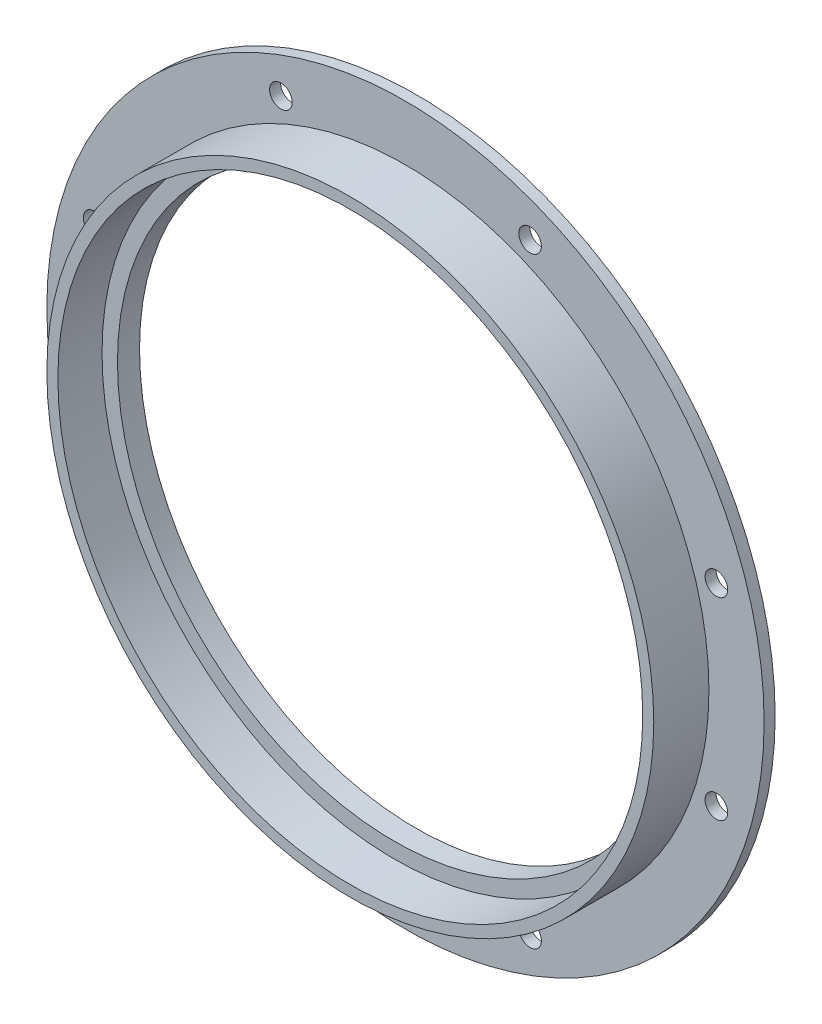
ISO-10303-21;
HEADER;
FILE_DESCRIPTION(('STEP AP214'),'2;1');
FILE_NAME('part.step','',(''),(''),'','','');
FILE_SCHEMA(('AUTOMOTIVE_DESIGN { 1 0 10303 214 1 1 1 1 }'));
ENDSEC;
DATA;
#1=APPLICATION_CONTEXT('core data for automotive mechanical design processes');
#2=APPLICATION_PROTOCOL_DEFINITION('international standard','automotive_design',2000,#1);
#3=PRODUCT_CONTEXT('',#1,'mechanical');
#4=PRODUCT('Part','Part','',(#3));
#5=PRODUCT_RELATED_PRODUCT_CATEGORY('part','',(#4));
#6=PRODUCT_DEFINITION_FORMATION('','',#4);
#7=PRODUCT_DEFINITION_CONTEXT('part definition',#1,'design');
#8=PRODUCT_DEFINITION('design','',#6,#7);
#9=PRODUCT_DEFINITION_SHAPE('','',#8);
#10=(LENGTH_UNIT() NAMED_UNIT(*) SI_UNIT(.MILLI.,.METRE.));
#11=(NAMED_UNIT(*) PLANE_ANGLE_UNIT() SI_UNIT($,.RADIAN.));
#12=(NAMED_UNIT(*) SI_UNIT($,.STERADIAN.) SOLID_ANGLE_UNIT());
#13=UNCERTAINTY_MEASURE_WITH_UNIT(LENGTH_MEASURE(1.E-05),#10,'distance_accuracy_value','');
#14=(GEOMETRIC_REPRESENTATION_CONTEXT(3) GLOBAL_UNCERTAINTY_ASSIGNED_CONTEXT((#13)) GLOBAL_UNIT_ASSIGNED_CONTEXT((#10,
#11,#12)) REPRESENTATION_CONTEXT('',''));
#15=CARTESIAN_POINT('',(0.,0.,0.));
#16=DIRECTION('',(0.,0.,1.));
#17=DIRECTION('',(1.,0.,0.));
#18=AXIS2_PLACEMENT_3D('',#15,#16,#17);
#19=CARTESIAN_POINT('',(0.,0.,2.));
#20=DIRECTION('',(0.,0.,1.));
#21=DIRECTION('',(1.,0.,0.));
#22=AXIS2_PLACEMENT_3D('',#19,#20,#21);
#23=CYLINDRICAL_SURFACE('',#22,55.);
#24=CARTESIAN_POINT('',(0.,0.,10.));
#25=DIRECTION('',(0.,0.,1.));
#26=DIRECTION('',(1.,0.,0.));
#27=AXIS2_PLACEMENT_3D('',#24,#25,#26);
#28=CIRCLE('',#27,55.);
#29=CARTESIAN_POINT('',(55.,0.,10.));
#30=VERTEX_POINT('',#29);
#31=EDGE_CURVE('E41',#30,#30,#28,.T.);
#32=ORIENTED_EDGE('',*,*,#31,.F.);
#33=EDGE_LOOP('',(#32));
#34=FACE_BOUND('',#33,.T.);
#35=CARTESIAN_POINT('',(0.,0.,0.));
#36=DIRECTION('',(0.,0.,-1.));
#37=DIRECTION('',(-1.,0.,0.));
#38=AXIS2_PLACEMENT_3D('',#35,#36,#37);
#39=CIRCLE('',#38,55.);
#40=CARTESIAN_POINT('',(-55.,0.,0.));
#41=VERTEX_POINT('',#40);
#42=EDGE_CURVE('E61',#41,#41,#39,.F.);
#43=ORIENTED_EDGE('',*,*,#42,.T.);
#44=EDGE_LOOP('',(#43));
#45=FACE_BOUND('',#44,.T.);
#46=ADVANCED_FACE('F37',(#34,#45),#23,.T.);
#47=CARTESIAN_POINT('',(0.,0.,159.906637611548));
#48=DIRECTION('',(0.,0.,-1.));
#49=DIRECTION('',(-1.,0.,0.));
#50=AXIS2_PLACEMENT_3D('',#47,#48,#49);
#51=CYLINDRICAL_SURFACE('',#50,53.);
#52=CARTESIAN_POINT('',(0.,0.,10.));
#53=DIRECTION('',(0.,0.,1.));
#54=DIRECTION('',(1.,0.,0.));
#55=AXIS2_PLACEMENT_3D('',#52,#53,#54);
#56=CIRCLE('',#55,53.);
#57=CARTESIAN_POINT('',(53.,0.,10.));
#58=VERTEX_POINT('',#57);
#59=EDGE_CURVE('E49',#58,#58,#56,.T.);
#60=ORIENTED_EDGE('',*,*,#59,.T.);
#61=EDGE_LOOP('',(#60));
#62=FACE_BOUND('',#61,.T.);
#63=CARTESIAN_POINT('',(0.,0.,2.));
#64=DIRECTION('',(0.,0.,-1.));
#65=DIRECTION('',(-1.,0.,0.));
#66=AXIS2_PLACEMENT_3D('',#63,#64,#65);
#67=CIRCLE('',#66,53.);
#68=CARTESIAN_POINT('',(-53.,0.,2.));
#69=VERTEX_POINT('',#68);
#70=EDGE_CURVE('E11',#69,#69,#67,.F.);
#71=ORIENTED_EDGE('',*,*,#70,.F.);
#72=EDGE_LOOP('',(#71));
#73=FACE_BOUND('',#72,.T.);
#74=ADVANCED_FACE('F166',(#62,#73),#51,.F.);
#75=CARTESIAN_POINT('',(0.,0.,10.));
#76=DIRECTION('',(0.,0.,1.));
#77=DIRECTION('',(1.,0.,0.));
#78=AXIS2_PLACEMENT_3D('',#75,#76,#77);
#79=PLANE('',#78);
#80=ORIENTED_EDGE('',*,*,#59,.F.);
#81=EDGE_LOOP('',(#80));
#82=FACE_BOUND('',#81,.T.);
#83=ORIENTED_EDGE('',*,*,#31,.T.);
#84=EDGE_LOOP('',(#83));
#85=FACE_BOUND('',#84,.T.);
#86=ADVANCED_FACE('F39',(#82,#85),#79,.T.);
#87=CARTESIAN_POINT('',(0.,0.,2.));
#88=DIRECTION('',(0.,0.,-1.));
#89=DIRECTION('',(-1.,0.,0.));
#90=AXIS2_PLACEMENT_3D('',#87,#88,#89);
#91=PLANE('',#90);
#92=CARTESIAN_POINT('',(0.,0.,2.));
#93=DIRECTION('',(0.,0.,-1.));
#94=DIRECTION('',(-1.,0.,0.));
#95=AXIS2_PLACEMENT_3D('',#92,#93,#94);
#96=CIRCLE('',#95,50.2);
#97=CARTESIAN_POINT('',(-50.2,0.,2.));
#98=VERTEX_POINT('',#97);
#99=EDGE_CURVE('E51',#98,#98,#96,.T.);
#100=ORIENTED_EDGE('',*,*,#99,.T.);
#101=EDGE_LOOP('',(#100));
#102=FACE_BOUND('',#101,.T.);
#103=ORIENTED_EDGE('',*,*,#70,.T.);
#104=EDGE_LOOP('',(#103));
#105=FACE_BOUND('',#104,.T.);
#106=ADVANCED_FACE('F134',(#102,#105),#91,.F.);
#107=CARTESIAN_POINT('',(0.,0.,-2.));
#108=DIRECTION('',(0.,0.,-1.));
#109=DIRECTION('',(-1.,0.,0.));
#110=AXIS2_PLACEMENT_3D('',#107,#108,#109);
#111=PLANE('',#110);
#112=CARTESIAN_POINT('',(0.,0.,-2.));
#113=DIRECTION('',(0.,0.,-1.));
#114=DIRECTION('',(-1.,0.,0.));
#115=AXIS2_PLACEMENT_3D('',#112,#113,#114);
#116=CIRCLE('',#115,50.2);
#117=CARTESIAN_POINT('',(-50.2,0.,-2.));
#118=VERTEX_POINT('',#117);
#119=EDGE_CURVE('E54',#118,#118,#116,.T.);
#120=ORIENTED_EDGE('',*,*,#119,.F.);
#121=EDGE_LOOP('',(#120));
#122=FACE_BOUND('',#121,.T.);
#123=CARTESIAN_POINT('',(22.5783225095407,54.5088924181658,-2.));
#124=DIRECTION('',(0.,0.,-1.));
#125=DIRECTION('',(-1.,0.,0.));
#126=AXIS2_PLACEMENT_3D('',#123,#124,#125);
#127=CIRCLE('',#126,2.05);
#128=CARTESIAN_POINT('',(20.5283225095407,54.5088924181658,-2.));
#129=VERTEX_POINT('',#128);
#130=EDGE_CURVE('E114',#129,#129,#127,.T.);
#131=ORIENTED_EDGE('',*,*,#130,.F.);
#132=EDGE_LOOP('',(#131));
#133=FACE_BOUND('',#132,.T.);
#134=CARTESIAN_POINT('',(-56.3449199129788,-17.5,-2.));
#135=DIRECTION('',(0.,0.,-1.));
#136=DIRECTION('',(-1.,0.,0.));
#137=AXIS2_PLACEMENT_3D('',#134,#135,#136);
#138=CIRCLE('',#137,2.04999999999999);
#139=CARTESIAN_POINT('',(-58.3949199129788,-17.5,-2.));
#140=VERTEX_POINT('',#139);
#141=EDGE_CURVE('E108',#140,#140,#138,.T.);
#142=ORIENTED_EDGE('',*,*,#141,.F.);
#143=EDGE_LOOP('',(#142));
#144=FACE_BOUND('',#143,.T.);
#145=CARTESIAN_POINT('',(-56.3449199129788,17.5,-2.));
#146=DIRECTION('',(0.,0.,-1.));
#147=DIRECTION('',(-1.,0.,0.));
#148=AXIS2_PLACEMENT_3D('',#145,#146,#147);
#149=CIRCLE('',#148,2.04999999999999);
#150=CARTESIAN_POINT('',(-58.3949199129788,17.5,-2.));
#151=VERTEX_POINT('',#150);
#152=EDGE_CURVE('E102',#151,#151,#149,.T.);
#153=ORIENTED_EDGE('',*,*,#152,.F.);
#154=EDGE_LOOP('',(#153));
#155=FACE_BOUND('',#154,.T.);
#156=CARTESIAN_POINT('',(22.5783225095399,-54.5088924181661,-2.));
#157=DIRECTION('',(0.,0.,-1.));
#158=DIRECTION('',(-1.,0.,0.));
#159=AXIS2_PLACEMENT_3D('',#156,#157,#158);
#160=CIRCLE('',#159,2.05);
#161=CARTESIAN_POINT('',(20.5283225095399,-54.5088924181661,-2.));
#162=VERTEX_POINT('',#161);
#163=EDGE_CURVE('E96',#162,#162,#160,.T.);
#164=ORIENTED_EDGE('',*,*,#163,.F.);
#165=EDGE_LOOP('',(#164));
#166=FACE_BOUND('',#165,.T.);
#167=CARTESIAN_POINT('',(-22.5783225095407,-54.5088924181658,-2.));
#168=DIRECTION('',(0.,0.,-1.));
#169=DIRECTION('',(-1.,0.,0.));
#170=AXIS2_PLACEMENT_3D('',#167,#168,#169);
#171=CIRCLE('',#170,2.05);
#172=CARTESIAN_POINT('',(-24.6283225095406,-54.5088924181658,-2.));
#173=VERTEX_POINT('',#172);
#174=EDGE_CURVE('E90',#173,#173,#171,.T.);
#175=ORIENTED_EDGE('',*,*,#174,.F.);
#176=EDGE_LOOP('',(#175));
#177=FACE_BOUND('',#176,.T.);
#178=CARTESIAN_POINT('',(56.3449199129789,-17.5,-2.));
#179=DIRECTION('',(0.,0.,-1.));
#180=DIRECTION('',(-1.,0.,0.));
#181=AXIS2_PLACEMENT_3D('',#178,#179,#180);
#182=CIRCLE('',#181,2.04999999999999);
#183=CARTESIAN_POINT('',(54.2949199129789,-17.5,-2.));
#184=VERTEX_POINT('',#183);
#185=EDGE_CURVE('E84',#184,#184,#182,.T.);
#186=ORIENTED_EDGE('',*,*,#185,.F.);
#187=EDGE_LOOP('',(#186));
#188=FACE_BOUND('',#187,.T.);
#189=CARTESIAN_POINT('',(56.3449199129789,17.5,-2.));
#190=DIRECTION('',(0.,0.,-1.));
#191=DIRECTION('',(-1.,0.,0.));
#192=AXIS2_PLACEMENT_3D('',#189,#190,#191);
#193=CIRCLE('',#192,2.04999999999999);
#194=CARTESIAN_POINT('',(54.2949199129789,17.5,-2.));
#195=VERTEX_POINT('',#194);
#196=EDGE_CURVE('E78',#195,#195,#193,.T.);
#197=ORIENTED_EDGE('',*,*,#196,.F.);
#198=EDGE_LOOP('',(#197));
#199=FACE_BOUND('',#198,.T.);
#200=CARTESIAN_POINT('',(-22.57832250954,54.5088924181661,-2.));
#201=DIRECTION('',(0.,0.,-1.));
#202=DIRECTION('',(-1.,0.,0.));
#203=AXIS2_PLACEMENT_3D('',#200,#201,#202);
#204=CIRCLE('',#203,2.05);
#205=CARTESIAN_POINT('',(-24.6283225095399,54.5088924181661,-2.));
#206=VERTEX_POINT('',#205);
#207=EDGE_CURVE('E72',#206,#206,#204,.T.);
#208=ORIENTED_EDGE('',*,*,#207,.F.);
#209=EDGE_LOOP('',(#208));
#210=FACE_BOUND('',#209,.T.);
#211=CARTESIAN_POINT('',(0.,0.,-2.));
#212=DIRECTION('',(0.,0.,-1.));
#213=DIRECTION('',(-1.,0.,0.));
#214=AXIS2_PLACEMENT_3D('',#211,#212,#213);
#215=CIRCLE('',#214,65.);
#216=CARTESIAN_POINT('',(-65.,0.,-2.));
#217=VERTEX_POINT('',#216);
#218=EDGE_CURVE('E66',#217,#217,#215,.T.);
#219=ORIENTED_EDGE('',*,*,#218,.T.);
#220=EDGE_LOOP('',(#219));
#221=FACE_BOUND('',#220,.T.);
#222=ADVANCED_FACE('F130',(#122,#133,#144,#155,#166,#177,#188,#199,#210,#221),#111,.T.);
#223=CARTESIAN_POINT('',(0.,0.,-2.));
#224=DIRECTION('',(0.,0.,1.));
#225=DIRECTION('',(1.,0.,0.));
#226=AXIS2_PLACEMENT_3D('',#223,#224,#225);
#227=CYLINDRICAL_SURFACE('',#226,50.2);
#228=ORIENTED_EDGE('',*,*,#119,.T.);
#229=EDGE_LOOP('',(#228));
#230=FACE_BOUND('',#229,.T.);
#231=ORIENTED_EDGE('',*,*,#99,.F.);
#232=EDGE_LOOP('',(#231));
#233=FACE_BOUND('',#232,.T.);
#234=ADVANCED_FACE('F133',(#230,#233),#227,.F.);
#235=CARTESIAN_POINT('',(0.,0.,0.));
#236=DIRECTION('',(0.,0.,-1.));
#237=DIRECTION('',(-1.,0.,0.));
#238=AXIS2_PLACEMENT_3D('',#235,#236,#237);
#239=CYLINDRICAL_SURFACE('',#238,65.);
#240=CARTESIAN_POINT('',(0.,0.,0.));
#241=DIRECTION('',(0.,0.,-1.));
#242=DIRECTION('',(-1.,0.,0.));
#243=AXIS2_PLACEMENT_3D('',#240,#241,#242);
#244=CIRCLE('',#243,65.);
#245=CARTESIAN_POINT('',(-65.,0.,0.));
#246=VERTEX_POINT('',#245);
#247=EDGE_CURVE('E65',#246,#246,#244,.T.);
#248=ORIENTED_EDGE('',*,*,#247,.T.);
#249=EDGE_LOOP('',(#248));
#250=FACE_BOUND('',#249,.T.);
#251=ORIENTED_EDGE('',*,*,#218,.F.);
#252=EDGE_LOOP('',(#251));
#253=FACE_BOUND('',#252,.T.);
#254=ADVANCED_FACE('F153',(#250,#253),#239,.T.);
#255=CARTESIAN_POINT('',(0.,0.,0.));
#256=DIRECTION('',(0.,0.,-1.));
#257=DIRECTION('',(-1.,0.,0.));
#258=AXIS2_PLACEMENT_3D('',#255,#256,#257);
#259=PLANE('',#258);
#260=ORIENTED_EDGE('',*,*,#42,.F.);
#261=EDGE_LOOP('',(#260));
#262=FACE_BOUND('',#261,.T.);
#263=CARTESIAN_POINT('',(22.5783225095407,54.5088924181658,0.));
#264=DIRECTION('',(0.,0.,-1.));
#265=DIRECTION('',(-1.,0.,0.));
#266=AXIS2_PLACEMENT_3D('',#263,#264,#265);
#267=CIRCLE('',#266,2.05);
#268=CARTESIAN_POINT('',(20.5283225095407,54.5088924181658,0.));
#269=VERTEX_POINT('',#268);
#270=EDGE_CURVE('E111',#269,#269,#267,.T.);
#271=ORIENTED_EDGE('',*,*,#270,.T.);
#272=EDGE_LOOP('',(#271));
#273=FACE_BOUND('',#272,.T.);
#274=CARTESIAN_POINT('',(-56.3449199129788,-17.5,0.));
#275=DIRECTION('',(0.,0.,-1.));
#276=DIRECTION('',(-1.,0.,0.));
#277=AXIS2_PLACEMENT_3D('',#274,#275,#276);
#278=CIRCLE('',#277,2.04999999999999);
#279=CARTESIAN_POINT('',(-58.3949199129788,-17.5,0.));
#280=VERTEX_POINT('',#279);
#281=EDGE_CURVE('E105',#280,#280,#278,.T.);
#282=ORIENTED_EDGE('',*,*,#281,.T.);
#283=EDGE_LOOP('',(#282));
#284=FACE_BOUND('',#283,.T.);
#285=CARTESIAN_POINT('',(-56.3449199129788,17.5,0.));
#286=DIRECTION('',(0.,0.,-1.));
#287=DIRECTION('',(-1.,0.,0.));
#288=AXIS2_PLACEMENT_3D('',#285,#286,#287);
#289=CIRCLE('',#288,2.04999999999999);
#290=CARTESIAN_POINT('',(-58.3949199129788,17.5,0.));
#291=VERTEX_POINT('',#290);
#292=EDGE_CURVE('E99',#291,#291,#289,.T.);
#293=ORIENTED_EDGE('',*,*,#292,.T.);
#294=EDGE_LOOP('',(#293));
#295=FACE_BOUND('',#294,.T.);
#296=CARTESIAN_POINT('',(22.5783225095399,-54.5088924181661,0.));
#297=DIRECTION('',(0.,0.,-1.));
#298=DIRECTION('',(-1.,0.,0.));
#299=AXIS2_PLACEMENT_3D('',#296,#297,#298);
#300=CIRCLE('',#299,2.05);
#301=CARTESIAN_POINT('',(20.5283225095399,-54.5088924181661,0.));
#302=VERTEX_POINT('',#301);
#303=EDGE_CURVE('E93',#302,#302,#300,.T.);
#304=ORIENTED_EDGE('',*,*,#303,.T.);
#305=EDGE_LOOP('',(#304));
#306=FACE_BOUND('',#305,.T.);
#307=CARTESIAN_POINT('',(-22.5783225095407,-54.5088924181658,0.));
#308=DIRECTION('',(0.,0.,-1.));
#309=DIRECTION('',(-1.,0.,0.));
#310=AXIS2_PLACEMENT_3D('',#307,#308,#309);
#311=CIRCLE('',#310,2.05);
#312=CARTESIAN_POINT('',(-24.6283225095406,-54.5088924181658,0.));
#313=VERTEX_POINT('',#312);
#314=EDGE_CURVE('E87',#313,#313,#311,.T.);
#315=ORIENTED_EDGE('',*,*,#314,.T.);
#316=EDGE_LOOP('',(#315));
#317=FACE_BOUND('',#316,.T.);
#318=CARTESIAN_POINT('',(56.3449199129789,-17.5,0.));
#319=DIRECTION('',(0.,0.,-1.));
#320=DIRECTION('',(-1.,0.,0.));
#321=AXIS2_PLACEMENT_3D('',#318,#319,#320);
#322=CIRCLE('',#321,2.04999999999999);
#323=CARTESIAN_POINT('',(54.2949199129789,-17.5,0.));
#324=VERTEX_POINT('',#323);
#325=EDGE_CURVE('E81',#324,#324,#322,.T.);
#326=ORIENTED_EDGE('',*,*,#325,.T.);
#327=EDGE_LOOP('',(#326));
#328=FACE_BOUND('',#327,.T.);
#329=CARTESIAN_POINT('',(56.3449199129789,17.5,0.));
#330=DIRECTION('',(0.,0.,-1.));
#331=DIRECTION('',(-1.,0.,0.));
#332=AXIS2_PLACEMENT_3D('',#329,#330,#331);
#333=CIRCLE('',#332,2.04999999999999);
#334=CARTESIAN_POINT('',(54.2949199129789,17.5,0.));
#335=VERTEX_POINT('',#334);
#336=EDGE_CURVE('E75',#335,#335,#333,.T.);
#337=ORIENTED_EDGE('',*,*,#336,.T.);
#338=EDGE_LOOP('',(#337));
#339=FACE_BOUND('',#338,.T.);
#340=CARTESIAN_POINT('',(-22.57832250954,54.5088924181661,0.));
#341=DIRECTION('',(0.,0.,-1.));
#342=DIRECTION('',(-1.,0.,0.));
#343=AXIS2_PLACEMENT_3D('',#340,#341,#342);
#344=CIRCLE('',#343,2.05);
#345=CARTESIAN_POINT('',(-24.6283225095399,54.5088924181661,0.));
#346=VERTEX_POINT('',#345);
#347=EDGE_CURVE('E69',#346,#346,#344,.T.);
#348=ORIENTED_EDGE('',*,*,#347,.T.);
#349=EDGE_LOOP('',(#348));
#350=FACE_BOUND('',#349,.T.);
#351=ORIENTED_EDGE('',*,*,#247,.F.);
#352=EDGE_LOOP('',(#351));
#353=FACE_BOUND('',#352,.T.);
#354=ADVANCED_FACE('F120',(#262,#273,#284,#295,#306,#317,#328,#339,#350,#353),#259,.F.);
#355=CARTESIAN_POINT('',(-22.57832250954,54.5088924181661,0.));
#356=DIRECTION('',(0.,0.,-1.));
#357=DIRECTION('',(-1.,0.,0.));
#358=AXIS2_PLACEMENT_3D('',#355,#356,#357);
#359=CYLINDRICAL_SURFACE('',#358,2.05);
#360=ORIENTED_EDGE('',*,*,#347,.F.);
#361=EDGE_LOOP('',(#360));
#362=FACE_BOUND('',#361,.T.);
#363=ORIENTED_EDGE('',*,*,#207,.T.);
#364=EDGE_LOOP('',(#363));
#365=FACE_BOUND('',#364,.T.);
#366=ADVANCED_FACE('F161',(#362,#365),#359,.F.);
#367=CARTESIAN_POINT('',(56.3449199129789,17.5,0.));
#368=DIRECTION('',(0.,0.,-1.));
#369=DIRECTION('',(-1.,0.,0.));
#370=AXIS2_PLACEMENT_3D('',#367,#368,#369);
#371=CYLINDRICAL_SURFACE('',#370,2.04999999999999);
#372=ORIENTED_EDGE('',*,*,#336,.F.);
#373=EDGE_LOOP('',(#372));
#374=FACE_BOUND('',#373,.T.);
#375=ORIENTED_EDGE('',*,*,#196,.T.);
#376=EDGE_LOOP('',(#375));
#377=FACE_BOUND('',#376,.T.);
#378=ADVANCED_FACE('F233',(#374,#377),#371,.F.);
#379=CARTESIAN_POINT('',(56.3449199129789,-17.5,0.));
#380=DIRECTION('',(0.,0.,-1.));
#381=DIRECTION('',(-1.,0.,0.));
#382=AXIS2_PLACEMENT_3D('',#379,#380,#381);
#383=CYLINDRICAL_SURFACE('',#382,2.04999999999999);
#384=ORIENTED_EDGE('',*,*,#325,.F.);
#385=EDGE_LOOP('',(#384));
#386=FACE_BOUND('',#385,.T.);
#387=ORIENTED_EDGE('',*,*,#185,.T.);
#388=EDGE_LOOP('',(#387));
#389=FACE_BOUND('',#388,.T.);
#390=ADVANCED_FACE('F243',(#386,#389),#383,.F.);
#391=CARTESIAN_POINT('',(-22.5783225095407,-54.5088924181658,0.));
#392=DIRECTION('',(0.,0.,-1.));
#393=DIRECTION('',(-1.,0.,0.));
#394=AXIS2_PLACEMENT_3D('',#391,#392,#393);
#395=CYLINDRICAL_SURFACE('',#394,2.05);
#396=ORIENTED_EDGE('',*,*,#314,.F.);
#397=EDGE_LOOP('',(#396));
#398=FACE_BOUND('',#397,.T.);
#399=ORIENTED_EDGE('',*,*,#174,.T.);
#400=EDGE_LOOP('',(#399));
#401=FACE_BOUND('',#400,.T.);
#402=ADVANCED_FACE('F253',(#398,#401),#395,.F.);
#403=CARTESIAN_POINT('',(22.5783225095399,-54.5088924181661,0.));
#404=DIRECTION('',(0.,0.,-1.));
#405=DIRECTION('',(-1.,0.,0.));
#406=AXIS2_PLACEMENT_3D('',#403,#404,#405);
#407=CYLINDRICAL_SURFACE('',#406,2.05);
#408=ORIENTED_EDGE('',*,*,#303,.F.);
#409=EDGE_LOOP('',(#408));
#410=FACE_BOUND('',#409,.T.);
#411=ORIENTED_EDGE('',*,*,#163,.T.);
#412=EDGE_LOOP('',(#411));
#413=FACE_BOUND('',#412,.T.);
#414=ADVANCED_FACE('F263',(#410,#413),#407,.F.);
#415=CARTESIAN_POINT('',(-56.3449199129788,17.5,0.));
#416=DIRECTION('',(0.,0.,-1.));
#417=DIRECTION('',(-1.,0.,0.));
#418=AXIS2_PLACEMENT_3D('',#415,#416,#417);
#419=CYLINDRICAL_SURFACE('',#418,2.04999999999999);
#420=ORIENTED_EDGE('',*,*,#292,.F.);
#421=EDGE_LOOP('',(#420));
#422=FACE_BOUND('',#421,.T.);
#423=ORIENTED_EDGE('',*,*,#152,.T.);
#424=EDGE_LOOP('',(#423));
#425=FACE_BOUND('',#424,.T.);
#426=ADVANCED_FACE('F273',(#422,#425),#419,.F.);
#427=CARTESIAN_POINT('',(-56.3449199129788,-17.5,0.));
#428=DIRECTION('',(0.,0.,-1.));
#429=DIRECTION('',(-1.,0.,0.));
#430=AXIS2_PLACEMENT_3D('',#427,#428,#429);
#431=CYLINDRICAL_SURFACE('',#430,2.04999999999999);
#432=ORIENTED_EDGE('',*,*,#281,.F.);
#433=EDGE_LOOP('',(#432));
#434=FACE_BOUND('',#433,.T.);
#435=ORIENTED_EDGE('',*,*,#141,.T.);
#436=EDGE_LOOP('',(#435));
#437=FACE_BOUND('',#436,.T.);
#438=ADVANCED_FACE('F126',(#434,#437),#431,.F.);
#439=CARTESIAN_POINT('',(22.5783225095407,54.5088924181658,0.));
#440=DIRECTION('',(0.,0.,-1.));
#441=DIRECTION('',(-1.,0.,0.));
#442=AXIS2_PLACEMENT_3D('',#439,#440,#441);
#443=CYLINDRICAL_SURFACE('',#442,2.05);
#444=ORIENTED_EDGE('',*,*,#270,.F.);
#445=EDGE_LOOP('',(#444));
#446=FACE_BOUND('',#445,.T.);
#447=ORIENTED_EDGE('',*,*,#130,.T.);
#448=EDGE_LOOP('',(#447));
#449=FACE_BOUND('',#448,.T.);
#450=ADVANCED_FACE('F123',(#446,#449),#443,.F.);
#451=CLOSED_SHELL('',(#46,#74,#86,#106,#222,#234,#254,#354,#366,#378,#390,#402,#414,#426,#438,#450));
#452=MANIFOLD_SOLID_BREP('B2',#451);
#453=ADVANCED_BREP_SHAPE_REPRESENTATION('',(#18,#452),#14);
#454=SHAPE_DEFINITION_REPRESENTATION(#9,#453);
ENDSEC;
END-ISO-10303-21;
